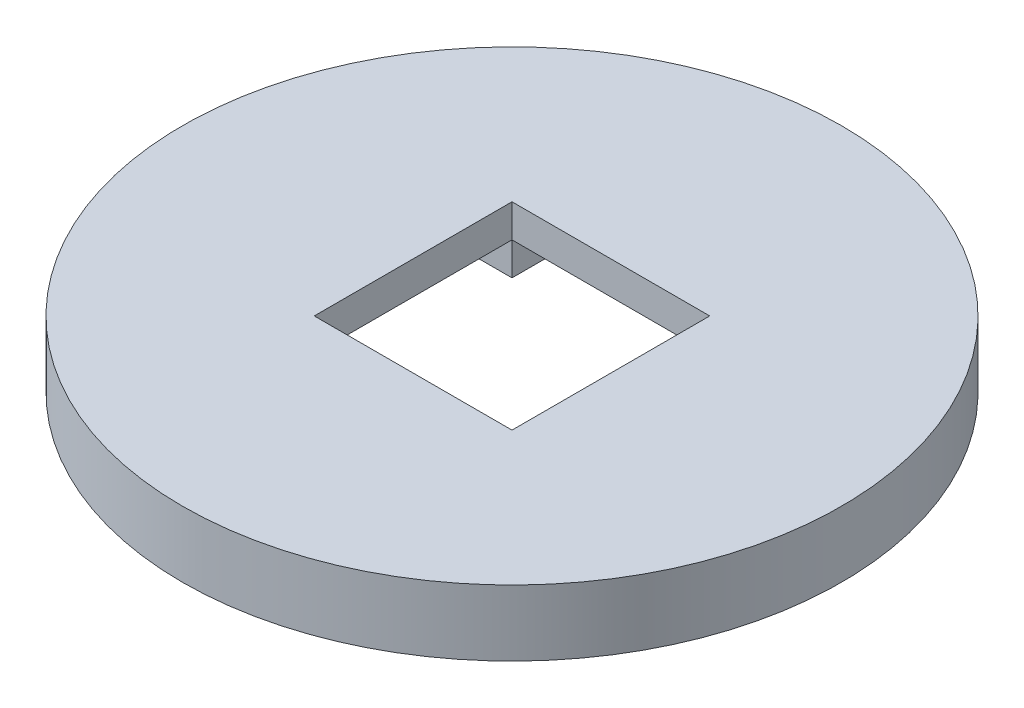
ISO-10303-21;
HEADER;
FILE_DESCRIPTION(('STEP AP214'),'2;1');
FILE_NAME('part.step','',(''),(''),'','','');
FILE_SCHEMA(('AUTOMOTIVE_DESIGN { 1 0 10303 214 1 1 1 1 }'));
ENDSEC;
DATA;
#1=APPLICATION_CONTEXT('core data for automotive mechanical design processes');
#2=APPLICATION_PROTOCOL_DEFINITION('international standard','automotive_design',2000,#1);
#3=PRODUCT_CONTEXT('',#1,'mechanical');
#4=PRODUCT('Part','Part','',(#3));
#5=PRODUCT_RELATED_PRODUCT_CATEGORY('part','',(#4));
#6=PRODUCT_DEFINITION_FORMATION('','',#4);
#7=PRODUCT_DEFINITION_CONTEXT('part definition',#1,'design');
#8=PRODUCT_DEFINITION('design','',#6,#7);
#9=PRODUCT_DEFINITION_SHAPE('','',#8);
#10=(LENGTH_UNIT() NAMED_UNIT(*) SI_UNIT(.MILLI.,.METRE.));
#11=(NAMED_UNIT(*) PLANE_ANGLE_UNIT() SI_UNIT($,.RADIAN.));
#12=(NAMED_UNIT(*) SI_UNIT($,.STERADIAN.) SOLID_ANGLE_UNIT());
#13=UNCERTAINTY_MEASURE_WITH_UNIT(LENGTH_MEASURE(1.E-05),#10,'distance_accuracy_value','');
#14=(GEOMETRIC_REPRESENTATION_CONTEXT(3) GLOBAL_UNCERTAINTY_ASSIGNED_CONTEXT((#13)) GLOBAL_UNIT_ASSIGNED_CONTEXT((#10,
#11,#12)) REPRESENTATION_CONTEXT('',''));
#15=CARTESIAN_POINT('',(0.,0.,0.));
#16=DIRECTION('',(0.,0.,1.));
#17=DIRECTION('',(1.,0.,0.));
#18=AXIS2_PLACEMENT_3D('',#15,#16,#17);
#19=CARTESIAN_POINT('',(0.,10.,15.));
#20=DIRECTION('',(0.,0.,-1.));
#21=DIRECTION('',(-1.,0.,0.));
#22=AXIS2_PLACEMENT_3D('',#19,#20,#21);
#23=PLANE('',#22);
#24=DIRECTION('',(1.,0.,0.));
#25=VECTOR('',#24,1.);
#26=CARTESIAN_POINT('',(0.,0.,15.));
#27=LINE('',#26,#25);
#28=CARTESIAN_POINT('',(15.,0.,15.));
#29=VERTEX_POINT('',#28);
#30=CARTESIAN_POINT('',(30.,0.,15.));
#31=VERTEX_POINT('',#30);
#32=EDGE_CURVE('E173',#29,#31,#27,.T.);
#33=ORIENTED_EDGE('',*,*,#32,.F.);
#34=DIRECTION('',(0.,-1.,0.));
#35=VECTOR('',#34,1.);
#36=CARTESIAN_POINT('',(15.,5.,15.));
#37=LINE('',#36,#35);
#38=CARTESIAN_POINT('',(15.,5.,15.));
#39=VERTEX_POINT('',#38);
#40=EDGE_CURVE('E148',#39,#29,#37,.T.);
#41=ORIENTED_EDGE('',*,*,#40,.F.);
#42=DIRECTION('',(1.,0.,0.));
#43=VECTOR('',#42,1.);
#44=CARTESIAN_POINT('',(0.,5.,15.));
#45=LINE('',#44,#43);
#46=CARTESIAN_POINT('',(30.,5.,15.));
#47=VERTEX_POINT('',#46);
#48=EDGE_CURVE('E171',#39,#47,#45,.T.);
#49=ORIENTED_EDGE('',*,*,#48,.T.);
#50=DIRECTION('',(0.,-1.,0.));
#51=VECTOR('',#50,1.);
#52=CARTESIAN_POINT('',(30.,5.,15.));
#53=LINE('',#52,#51);
#54=EDGE_CURVE('E241',#47,#31,#53,.T.);
#55=ORIENTED_EDGE('',*,*,#54,.T.);
#56=EDGE_LOOP('',(#33,#41,#49,#55));
#57=FACE_BOUND('',#56,.T.);
#58=ADVANCED_FACE('F39',(#57),#23,.T.);
#59=DIRECTION('',(0.,-1.,0.));
#60=VECTOR('',#59,1.);
#61=CARTESIAN_POINT('',(15.,10.,15.));
#62=LINE('',#61,#60);
#63=CARTESIAN_POINT('',(15.,10.,15.));
#64=VERTEX_POINT('',#63);
#65=EDGE_CURVE('E190',#64,#39,#62,.T.);
#66=ORIENTED_EDGE('',*,*,#65,.T.);
#67=DIRECTION('',(1.,0.,0.));
#68=VECTOR('',#67,1.);
#69=CARTESIAN_POINT('',(0.,5.,15.));
#70=LINE('',#69,#68);
#71=CARTESIAN_POINT('',(-15.,5.,15.));
#72=VERTEX_POINT('',#71);
#73=EDGE_CURVE('E155',#72,#39,#70,.T.);
#74=ORIENTED_EDGE('',*,*,#73,.F.);
#75=DIRECTION('',(0.,-1.,0.));
#76=VECTOR('',#75,1.);
#77=CARTESIAN_POINT('',(-15.,10.,15.));
#78=LINE('',#77,#76);
#79=CARTESIAN_POINT('',(-15.,10.,15.));
#80=VERTEX_POINT('',#79);
#81=EDGE_CURVE('E199',#80,#72,#78,.T.);
#82=ORIENTED_EDGE('',*,*,#81,.F.);
#83=DIRECTION('',(1.,0.,0.));
#84=VECTOR('',#83,1.);
#85=CARTESIAN_POINT('',(0.,10.,15.));
#86=LINE('',#85,#84);
#87=EDGE_CURVE('E197',#80,#64,#86,.T.);
#88=ORIENTED_EDGE('',*,*,#87,.T.);
#89=EDGE_LOOP('',(#66,#74,#82,#88));
#90=FACE_BOUND('',#89,.T.);
#91=ADVANCED_FACE('F195',(#90),#23,.T.);
#92=CARTESIAN_POINT('',(0.,0.,0.));
#93=DIRECTION('',(0.,1.,0.));
#94=DIRECTION('',(0.,0.,1.));
#95=AXIS2_PLACEMENT_3D('',#92,#93,#94);
#96=PLANE('',#95);
#97=CARTESIAN_POINT('',(0.,0.,0.));
#98=DIRECTION('',(0.,1.,0.));
#99=DIRECTION('',(0.,0.,1.));
#100=AXIS2_PLACEMENT_3D('',#97,#98,#99);
#101=CIRCLE('',#100,50.);
#102=CARTESIAN_POINT('',(0.,0.,50.));
#103=VERTEX_POINT('',#102);
#104=EDGE_CURVE('E43',#103,#103,#101,.T.);
#105=ORIENTED_EDGE('',*,*,#104,.F.);
#106=EDGE_LOOP('',(#105));
#107=FACE_BOUND('',#106,.T.);
#108=CARTESIAN_POINT('',(-30.,0.,15.));
#109=VERTEX_POINT('',#108);
#110=CARTESIAN_POINT('',(-15.,0.,15.));
#111=VERTEX_POINT('',#110);
#112=EDGE_CURVE('E223',#109,#111,#27,.T.);
#113=ORIENTED_EDGE('',*,*,#112,.T.);
#114=DIRECTION('',(0.,0.,-1.));
#115=VECTOR('',#114,1.);
#116=CARTESIAN_POINT('',(-15.,0.,0.));
#117=LINE('',#116,#115);
#118=CARTESIAN_POINT('',(-15.,0.,30.));
#119=VERTEX_POINT('',#118);
#120=EDGE_CURVE('E484',#119,#111,#117,.T.);
#121=ORIENTED_EDGE('',*,*,#120,.F.);
#122=DIRECTION('',(1.,0.,0.));
#123=VECTOR('',#122,1.);
#124=CARTESIAN_POINT('',(0.,0.,30.));
#125=LINE('',#124,#123);
#126=CARTESIAN_POINT('',(15.,0.,30.));
#127=VERTEX_POINT('',#126);
#128=EDGE_CURVE('E481',#119,#127,#125,.T.);
#129=ORIENTED_EDGE('',*,*,#128,.T.);
#130=DIRECTION('',(0.,0.,-1.));
#131=VECTOR('',#130,1.);
#132=CARTESIAN_POINT('',(15.,0.,0.));
#133=LINE('',#132,#131);
#134=EDGE_CURVE('E240',#127,#29,#133,.T.);
#135=ORIENTED_EDGE('',*,*,#134,.T.);
#136=ORIENTED_EDGE('',*,*,#32,.T.);
#137=DIRECTION('',(0.,0.,-1.));
#138=VECTOR('',#137,1.);
#139=CARTESIAN_POINT('',(30.,0.,0.));
#140=LINE('',#139,#138);
#141=CARTESIAN_POINT('',(30.,0.,-15.));
#142=VERTEX_POINT('',#141);
#143=EDGE_CURVE('E238',#31,#142,#140,.T.);
#144=ORIENTED_EDGE('',*,*,#143,.T.);
#145=DIRECTION('',(1.,0.,0.));
#146=VECTOR('',#145,1.);
#147=CARTESIAN_POINT('',(0.,0.,-15.));
#148=LINE('',#147,#146);
#149=CARTESIAN_POINT('',(15.,0.,-15.));
#150=VERTEX_POINT('',#149);
#151=EDGE_CURVE('E222',#150,#142,#148,.T.);
#152=ORIENTED_EDGE('',*,*,#151,.F.);
#153=DIRECTION('',(0.,0.,-1.));
#154=VECTOR('',#153,1.);
#155=CARTESIAN_POINT('',(15.,0.,0.));
#156=LINE('',#155,#154);
#157=CARTESIAN_POINT('',(15.,0.,-30.));
#158=VERTEX_POINT('',#157);
#159=EDGE_CURVE('E312',#150,#158,#156,.T.);
#160=ORIENTED_EDGE('',*,*,#159,.T.);
#161=DIRECTION('',(1.,0.,0.));
#162=VECTOR('',#161,1.);
#163=CARTESIAN_POINT('',(0.,0.,-30.));
#164=LINE('',#163,#162);
#165=CARTESIAN_POINT('',(-15.,0.,-30.));
#166=VERTEX_POINT('',#165);
#167=EDGE_CURVE('E328',#166,#158,#164,.T.);
#168=ORIENTED_EDGE('',*,*,#167,.F.);
#169=DIRECTION('',(0.,0.,-1.));
#170=VECTOR('',#169,1.);
#171=CARTESIAN_POINT('',(-15.,0.,0.));
#172=LINE('',#171,#170);
#173=CARTESIAN_POINT('',(-15.,0.,-15.));
#174=VERTEX_POINT('',#173);
#175=EDGE_CURVE('E324',#174,#166,#172,.T.);
#176=ORIENTED_EDGE('',*,*,#175,.F.);
#177=CARTESIAN_POINT('',(-30.,0.,-15.));
#178=VERTEX_POINT('',#177);
#179=EDGE_CURVE('E219',#178,#174,#148,.T.);
#180=ORIENTED_EDGE('',*,*,#179,.F.);
#181=DIRECTION('',(0.,0.,-1.));
#182=VECTOR('',#181,1.);
#183=CARTESIAN_POINT('',(-30.,0.,0.));
#184=LINE('',#183,#182);
#185=EDGE_CURVE('E259',#109,#178,#184,.T.);
#186=ORIENTED_EDGE('',*,*,#185,.F.);
#187=EDGE_LOOP('',(#113,#121,#129,#135,#136,#144,#152,#160,#168,#176,#180,#186));
#188=FACE_BOUND('',#187,.T.);
#189=ADVANCED_FACE('F235',(#107,#188),#96,.F.);
#190=CARTESIAN_POINT('',(0.,10.,-15.));
#191=DIRECTION('',(0.,0.,-1.));
#192=DIRECTION('',(-1.,0.,0.));
#193=AXIS2_PLACEMENT_3D('',#190,#191,#192);
#194=PLANE('',#193);
#195=DIRECTION('',(0.,-1.,0.));
#196=VECTOR('',#195,1.);
#197=CARTESIAN_POINT('',(15.,5.,-15.));
#198=LINE('',#197,#196);
#199=CARTESIAN_POINT('',(15.,5.,-15.));
#200=VERTEX_POINT('',#199);
#201=EDGE_CURVE('E55',#200,#150,#198,.T.);
#202=ORIENTED_EDGE('',*,*,#201,.T.);
#203=ORIENTED_EDGE('',*,*,#151,.T.);
#204=DIRECTION('',(0.,-1.,0.));
#205=VECTOR('',#204,1.);
#206=CARTESIAN_POINT('',(30.,5.,-15.));
#207=LINE('',#206,#205);
#208=CARTESIAN_POINT('',(30.,5.,-15.));
#209=VERTEX_POINT('',#208);
#210=EDGE_CURVE('E244',#209,#142,#207,.T.);
#211=ORIENTED_EDGE('',*,*,#210,.F.);
#212=DIRECTION('',(1.,0.,0.));
#213=VECTOR('',#212,1.);
#214=CARTESIAN_POINT('',(0.,5.,-15.));
#215=LINE('',#214,#213);
#216=EDGE_CURVE('E193',#200,#209,#215,.T.);
#217=ORIENTED_EDGE('',*,*,#216,.F.);
#218=EDGE_LOOP('',(#202,#203,#211,#217));
#219=FACE_BOUND('',#218,.T.);
#220=ADVANCED_FACE('F271',(#219),#194,.F.);
#221=DIRECTION('',(1.,0.,0.));
#222=VECTOR('',#221,1.);
#223=CARTESIAN_POINT('',(0.,5.,-15.));
#224=LINE('',#223,#222);
#225=CARTESIAN_POINT('',(-15.,5.,-15.));
#226=VERTEX_POINT('',#225);
#227=EDGE_CURVE('E267',#226,#200,#224,.T.);
#228=ORIENTED_EDGE('',*,*,#227,.T.);
#229=DIRECTION('',(0.,-1.,0.));
#230=VECTOR('',#229,1.);
#231=CARTESIAN_POINT('',(15.,10.,-15.));
#232=LINE('',#231,#230);
#233=CARTESIAN_POINT('',(15.,10.,-15.));
#234=VERTEX_POINT('',#233);
#235=EDGE_CURVE('E63',#234,#200,#232,.T.);
#236=ORIENTED_EDGE('',*,*,#235,.F.);
#237=DIRECTION('',(1.,0.,0.));
#238=VECTOR('',#237,1.);
#239=CARTESIAN_POINT('',(0.,10.,-15.));
#240=LINE('',#239,#238);
#241=CARTESIAN_POINT('',(-15.,10.,-15.));
#242=VERTEX_POINT('',#241);
#243=EDGE_CURVE('E215',#242,#234,#240,.T.);
#244=ORIENTED_EDGE('',*,*,#243,.F.);
#245=DIRECTION('',(0.,-1.,0.));
#246=VECTOR('',#245,1.);
#247=CARTESIAN_POINT('',(-15.,10.,-15.));
#248=LINE('',#247,#246);
#249=EDGE_CURVE('E205',#242,#226,#248,.T.);
#250=ORIENTED_EDGE('',*,*,#249,.T.);
#251=EDGE_LOOP('',(#228,#236,#244,#250));
#252=FACE_BOUND('',#251,.T.);
#253=ADVANCED_FACE('F266',(#252),#194,.F.);
#254=CARTESIAN_POINT('',(-15.,10.,0.));
#255=DIRECTION('',(-1.,0.,0.));
#256=DIRECTION('',(0.,0.,1.));
#257=AXIS2_PLACEMENT_3D('',#254,#255,#256);
#258=PLANE('',#257);
#259=DIRECTION('',(0.,0.,-1.));
#260=VECTOR('',#259,1.);
#261=CARTESIAN_POINT('',(-15.,5.,0.));
#262=LINE('',#261,#260);
#263=EDGE_CURVE('E351',#72,#226,#262,.T.);
#264=ORIENTED_EDGE('',*,*,#263,.T.);
#265=ORIENTED_EDGE('',*,*,#249,.F.);
#266=DIRECTION('',(0.,0.,-1.));
#267=VECTOR('',#266,1.);
#268=CARTESIAN_POINT('',(-15.,10.,0.));
#269=LINE('',#268,#267);
#270=EDGE_CURVE('E226',#80,#242,#269,.T.);
#271=ORIENTED_EDGE('',*,*,#270,.F.);
#272=ORIENTED_EDGE('',*,*,#81,.T.);
#273=EDGE_LOOP('',(#264,#265,#271,#272));
#274=FACE_BOUND('',#273,.T.);
#275=ADVANCED_FACE('F270',(#274),#258,.F.);
#276=CARTESIAN_POINT('',(15.,10.,0.));
#277=DIRECTION('',(-1.,0.,0.));
#278=DIRECTION('',(0.,0.,1.));
#279=AXIS2_PLACEMENT_3D('',#276,#277,#278);
#280=PLANE('',#279);
#281=ORIENTED_EDGE('',*,*,#235,.T.);
#282=DIRECTION('',(0.,0.,-1.));
#283=VECTOR('',#282,1.);
#284=CARTESIAN_POINT('',(15.,5.,0.));
#285=LINE('',#284,#283);
#286=EDGE_CURVE('E183',#39,#200,#285,.T.);
#287=ORIENTED_EDGE('',*,*,#286,.F.);
#288=ORIENTED_EDGE('',*,*,#65,.F.);
#289=DIRECTION('',(0.,0.,-1.));
#290=VECTOR('',#289,1.);
#291=CARTESIAN_POINT('',(15.,10.,0.));
#292=LINE('',#291,#290);
#293=EDGE_CURVE('E212',#64,#234,#292,.T.);
#294=ORIENTED_EDGE('',*,*,#293,.T.);
#295=EDGE_LOOP('',(#281,#287,#288,#294));
#296=FACE_BOUND('',#295,.T.);
#297=ADVANCED_FACE('F189',(#296),#280,.T.);
#298=CARTESIAN_POINT('',(0.,10.,0.));
#299=DIRECTION('',(0.,-1.,0.));
#300=DIRECTION('',(0.,0.,-1.));
#301=AXIS2_PLACEMENT_3D('',#298,#299,#300);
#302=CYLINDRICAL_SURFACE('',#301,50.);
#303=CARTESIAN_POINT('',(0.,10.,0.));
#304=DIRECTION('',(0.,1.,0.));
#305=DIRECTION('',(0.,0.,1.));
#306=AXIS2_PLACEMENT_3D('',#303,#304,#305);
#307=CIRCLE('',#306,50.);
#308=CARTESIAN_POINT('',(0.,10.,50.));
#309=VERTEX_POINT('',#308);
#310=EDGE_CURVE('E11',#309,#309,#307,.T.);
#311=ORIENTED_EDGE('',*,*,#310,.F.);
#312=EDGE_LOOP('',(#311));
#313=FACE_BOUND('',#312,.T.);
#314=ORIENTED_EDGE('',*,*,#104,.T.);
#315=EDGE_LOOP('',(#314));
#316=FACE_BOUND('',#315,.T.);
#317=ADVANCED_FACE('F41',(#313,#316),#302,.T.);
#318=CARTESIAN_POINT('',(0.,10.,0.));
#319=DIRECTION('',(0.,1.,0.));
#320=DIRECTION('',(0.,0.,1.));
#321=AXIS2_PLACEMENT_3D('',#318,#319,#320);
#322=PLANE('',#321);
#323=ORIENTED_EDGE('',*,*,#270,.T.);
#324=ORIENTED_EDGE('',*,*,#243,.T.);
#325=ORIENTED_EDGE('',*,*,#293,.F.);
#326=ORIENTED_EDGE('',*,*,#87,.F.);
#327=EDGE_LOOP('',(#323,#324,#325,#326));
#328=FACE_BOUND('',#327,.T.);
#329=ORIENTED_EDGE('',*,*,#310,.T.);
#330=EDGE_LOOP('',(#329));
#331=FACE_BOUND('',#330,.T.);
#332=ADVANCED_FACE('F263',(#328,#331),#322,.T.);
#333=DIRECTION('',(0.,-1.,0.));
#334=VECTOR('',#333,1.);
#335=CARTESIAN_POINT('',(-15.,5.,15.));
#336=LINE('',#335,#334);
#337=EDGE_CURVE('E175',#72,#111,#336,.T.);
#338=ORIENTED_EDGE('',*,*,#337,.T.);
#339=ORIENTED_EDGE('',*,*,#112,.F.);
#340=DIRECTION('',(0.,-1.,0.));
#341=VECTOR('',#340,1.);
#342=CARTESIAN_POINT('',(-30.,5.,15.));
#343=LINE('',#342,#341);
#344=CARTESIAN_POINT('',(-30.,5.,15.));
#345=VERTEX_POINT('',#344);
#346=EDGE_CURVE('E361',#345,#109,#343,.T.);
#347=ORIENTED_EDGE('',*,*,#346,.F.);
#348=DIRECTION('',(1.,0.,0.));
#349=VECTOR('',#348,1.);
#350=CARTESIAN_POINT('',(0.,5.,15.));
#351=LINE('',#350,#349);
#352=EDGE_CURVE('E300',#345,#72,#351,.T.);
#353=ORIENTED_EDGE('',*,*,#352,.T.);
#354=EDGE_LOOP('',(#338,#339,#347,#353));
#355=FACE_BOUND('',#354,.T.);
#356=ADVANCED_FACE('F283',(#355),#23,.T.);
#357=ORIENTED_EDGE('',*,*,#179,.T.);
#358=DIRECTION('',(0.,-1.,0.));
#359=VECTOR('',#358,1.);
#360=CARTESIAN_POINT('',(-15.,5.,-15.));
#361=LINE('',#360,#359);
#362=EDGE_CURVE('E323',#226,#174,#361,.T.);
#363=ORIENTED_EDGE('',*,*,#362,.F.);
#364=DIRECTION('',(1.,0.,0.));
#365=VECTOR('',#364,1.);
#366=CARTESIAN_POINT('',(0.,5.,-15.));
#367=LINE('',#366,#365);
#368=CARTESIAN_POINT('',(-30.,5.,-15.));
#369=VERTEX_POINT('',#368);
#370=EDGE_CURVE('E347',#369,#226,#367,.T.);
#371=ORIENTED_EDGE('',*,*,#370,.F.);
#372=DIRECTION('',(0.,-1.,0.));
#373=VECTOR('',#372,1.);
#374=CARTESIAN_POINT('',(-30.,5.,-15.));
#375=LINE('',#374,#373);
#376=EDGE_CURVE('E357',#369,#178,#375,.T.);
#377=ORIENTED_EDGE('',*,*,#376,.T.);
#378=EDGE_LOOP('',(#357,#363,#371,#377));
#379=FACE_BOUND('',#378,.T.);
#380=ADVANCED_FACE('F273',(#379),#194,.F.);
#381=CARTESIAN_POINT('',(30.,5.,0.));
#382=DIRECTION('',(-1.,0.,0.));
#383=DIRECTION('',(0.,0.,1.));
#384=AXIS2_PLACEMENT_3D('',#381,#382,#383);
#385=PLANE('',#384);
#386=ORIENTED_EDGE('',*,*,#143,.F.);
#387=ORIENTED_EDGE('',*,*,#54,.F.);
#388=DIRECTION('',(0.,0.,-1.));
#389=VECTOR('',#388,1.);
#390=CARTESIAN_POINT('',(30.,5.,0.));
#391=LINE('',#390,#389);
#392=EDGE_CURVE('E184',#47,#209,#391,.T.);
#393=ORIENTED_EDGE('',*,*,#392,.T.);
#394=ORIENTED_EDGE('',*,*,#210,.T.);
#395=EDGE_LOOP('',(#386,#387,#393,#394));
#396=FACE_BOUND('',#395,.T.);
#397=ADVANCED_FACE('F247',(#396),#385,.T.);
#398=CARTESIAN_POINT('',(0.,5.,0.));
#399=DIRECTION('',(0.,-1.,0.));
#400=DIRECTION('',(0.,0.,-1.));
#401=AXIS2_PLACEMENT_3D('',#398,#399,#400);
#402=PLANE('',#401);
#403=ORIENTED_EDGE('',*,*,#392,.F.);
#404=ORIENTED_EDGE('',*,*,#48,.F.);
#405=ORIENTED_EDGE('',*,*,#286,.T.);
#406=ORIENTED_EDGE('',*,*,#216,.T.);
#407=EDGE_LOOP('',(#403,#404,#405,#406));
#408=FACE_BOUND('',#407,.T.);
#409=ADVANCED_FACE('F181',(#408),#402,.T.);
#410=CARTESIAN_POINT('',(-30.,5.,0.));
#411=DIRECTION('',(-1.,0.,0.));
#412=DIRECTION('',(0.,0.,1.));
#413=AXIS2_PLACEMENT_3D('',#410,#411,#412);
#414=PLANE('',#413);
#415=ORIENTED_EDGE('',*,*,#185,.T.);
#416=ORIENTED_EDGE('',*,*,#376,.F.);
#417=DIRECTION('',(0.,0.,-1.));
#418=VECTOR('',#417,1.);
#419=CARTESIAN_POINT('',(-30.,5.,0.));
#420=LINE('',#419,#418);
#421=EDGE_CURVE('E343',#345,#369,#420,.T.);
#422=ORIENTED_EDGE('',*,*,#421,.F.);
#423=ORIENTED_EDGE('',*,*,#346,.T.);
#424=EDGE_LOOP('',(#415,#416,#422,#423));
#425=FACE_BOUND('',#424,.T.);
#426=ADVANCED_FACE('F370',(#425),#414,.F.);
#427=CARTESIAN_POINT('',(0.,5.,0.));
#428=DIRECTION('',(0.,-1.,0.));
#429=DIRECTION('',(0.,0.,-1.));
#430=AXIS2_PLACEMENT_3D('',#427,#428,#429);
#431=PLANE('',#430);
#432=ORIENTED_EDGE('',*,*,#421,.T.);
#433=ORIENTED_EDGE('',*,*,#370,.T.);
#434=ORIENTED_EDGE('',*,*,#263,.F.);
#435=ORIENTED_EDGE('',*,*,#352,.F.);
#436=EDGE_LOOP('',(#432,#433,#434,#435));
#437=FACE_BOUND('',#436,.T.);
#438=ADVANCED_FACE('F378',(#437),#431,.T.);
#439=CARTESIAN_POINT('',(15.,5.,0.));
#440=DIRECTION('',(-1.,0.,0.));
#441=DIRECTION('',(0.,0.,1.));
#442=AXIS2_PLACEMENT_3D('',#439,#440,#441);
#443=PLANE('',#442);
#444=ORIENTED_EDGE('',*,*,#159,.F.);
#445=ORIENTED_EDGE('',*,*,#201,.F.);
#446=DIRECTION('',(0.,0.,-1.));
#447=VECTOR('',#446,1.);
#448=CARTESIAN_POINT('',(15.,5.,0.));
#449=LINE('',#448,#447);
#450=CARTESIAN_POINT('',(15.,5.,-30.));
#451=VERTEX_POINT('',#450);
#452=EDGE_CURVE('E320',#200,#451,#449,.T.);
#453=ORIENTED_EDGE('',*,*,#452,.T.);
#454=DIRECTION('',(0.,-1.,0.));
#455=VECTOR('',#454,1.);
#456=CARTESIAN_POINT('',(15.,5.,-30.));
#457=LINE('',#456,#455);
#458=EDGE_CURVE('E254',#451,#158,#457,.T.);
#459=ORIENTED_EDGE('',*,*,#458,.T.);
#460=EDGE_LOOP('',(#444,#445,#453,#459));
#461=FACE_BOUND('',#460,.T.);
#462=ADVANCED_FACE('F380',(#461),#443,.T.);
#463=CARTESIAN_POINT('',(0.,5.,-30.));
#464=DIRECTION('',(0.,0.,-1.));
#465=DIRECTION('',(-1.,0.,0.));
#466=AXIS2_PLACEMENT_3D('',#463,#464,#465);
#467=PLANE('',#466);
#468=ORIENTED_EDGE('',*,*,#167,.T.);
#469=ORIENTED_EDGE('',*,*,#458,.F.);
#470=DIRECTION('',(1.,0.,0.));
#471=VECTOR('',#470,1.);
#472=CARTESIAN_POINT('',(0.,5.,-30.));
#473=LINE('',#472,#471);
#474=CARTESIAN_POINT('',(-15.,5.,-30.));
#475=VERTEX_POINT('',#474);
#476=EDGE_CURVE('E316',#475,#451,#473,.T.);
#477=ORIENTED_EDGE('',*,*,#476,.F.);
#478=DIRECTION('',(0.,-1.,0.));
#479=VECTOR('',#478,1.);
#480=CARTESIAN_POINT('',(-15.,5.,-30.));
#481=LINE('',#480,#479);
#482=EDGE_CURVE('E338',#475,#166,#481,.T.);
#483=ORIENTED_EDGE('',*,*,#482,.T.);
#484=EDGE_LOOP('',(#468,#469,#477,#483));
#485=FACE_BOUND('',#484,.T.);
#486=ADVANCED_FACE('F386',(#485),#467,.F.);
#487=CARTESIAN_POINT('',(-15.,5.,0.));
#488=DIRECTION('',(-1.,0.,0.));
#489=DIRECTION('',(0.,0.,1.));
#490=AXIS2_PLACEMENT_3D('',#487,#488,#489);
#491=PLANE('',#490);
#492=ORIENTED_EDGE('',*,*,#175,.T.);
#493=ORIENTED_EDGE('',*,*,#482,.F.);
#494=DIRECTION('',(0.,0.,-1.));
#495=VECTOR('',#494,1.);
#496=CARTESIAN_POINT('',(-15.,5.,0.));
#497=LINE('',#496,#495);
#498=EDGE_CURVE('E311',#226,#475,#497,.T.);
#499=ORIENTED_EDGE('',*,*,#498,.F.);
#500=ORIENTED_EDGE('',*,*,#362,.T.);
#501=EDGE_LOOP('',(#492,#493,#499,#500));
#502=FACE_BOUND('',#501,.T.);
#503=ADVANCED_FACE('F374',(#502),#491,.F.);
#504=CARTESIAN_POINT('',(0.,5.,0.));
#505=DIRECTION('',(0.,-1.,0.));
#506=DIRECTION('',(0.,0.,-1.));
#507=AXIS2_PLACEMENT_3D('',#504,#505,#506);
#508=PLANE('',#507);
#509=ORIENTED_EDGE('',*,*,#227,.F.);
#510=ORIENTED_EDGE('',*,*,#498,.T.);
#511=ORIENTED_EDGE('',*,*,#476,.T.);
#512=ORIENTED_EDGE('',*,*,#452,.F.);
#513=EDGE_LOOP('',(#509,#510,#511,#512));
#514=FACE_BOUND('',#513,.T.);
#515=ADVANCED_FACE('F433',(#514),#508,.T.);
#516=CARTESIAN_POINT('',(-15.,5.,0.));
#517=DIRECTION('',(-1.,0.,0.));
#518=DIRECTION('',(0.,0.,1.));
#519=AXIS2_PLACEMENT_3D('',#516,#517,#518);
#520=PLANE('',#519);
#521=ORIENTED_EDGE('',*,*,#120,.T.);
#522=ORIENTED_EDGE('',*,*,#337,.F.);
#523=DIRECTION('',(0.,0.,-1.));
#524=VECTOR('',#523,1.);
#525=CARTESIAN_POINT('',(-15.,5.,0.));
#526=LINE('',#525,#524);
#527=CARTESIAN_POINT('',(-15.,5.,30.));
#528=VERTEX_POINT('',#527);
#529=EDGE_CURVE('E160',#528,#72,#526,.T.);
#530=ORIENTED_EDGE('',*,*,#529,.F.);
#531=DIRECTION('',(0.,-1.,0.));
#532=VECTOR('',#531,1.);
#533=CARTESIAN_POINT('',(-15.,5.,30.));
#534=LINE('',#533,#532);
#535=EDGE_CURVE('E329',#528,#119,#534,.T.);
#536=ORIENTED_EDGE('',*,*,#535,.T.);
#537=EDGE_LOOP('',(#521,#522,#530,#536));
#538=FACE_BOUND('',#537,.T.);
#539=ADVANCED_FACE('F441',(#538),#520,.F.);
#540=CARTESIAN_POINT('',(0.,5.,30.));
#541=DIRECTION('',(0.,0.,-1.));
#542=DIRECTION('',(-1.,0.,0.));
#543=AXIS2_PLACEMENT_3D('',#540,#541,#542);
#544=PLANE('',#543);
#545=ORIENTED_EDGE('',*,*,#128,.F.);
#546=ORIENTED_EDGE('',*,*,#535,.F.);
#547=DIRECTION('',(1.,0.,0.));
#548=VECTOR('',#547,1.);
#549=CARTESIAN_POINT('',(0.,5.,30.));
#550=LINE('',#549,#548);
#551=CARTESIAN_POINT('',(15.,5.,30.));
#552=VERTEX_POINT('',#551);
#553=EDGE_CURVE('E154',#528,#552,#550,.T.);
#554=ORIENTED_EDGE('',*,*,#553,.T.);
#555=DIRECTION('',(0.,-1.,0.));
#556=VECTOR('',#555,1.);
#557=CARTESIAN_POINT('',(15.,5.,30.));
#558=LINE('',#557,#556);
#559=EDGE_CURVE('E150',#552,#127,#558,.T.);
#560=ORIENTED_EDGE('',*,*,#559,.T.);
#561=EDGE_LOOP('',(#545,#546,#554,#560));
#562=FACE_BOUND('',#561,.T.);
#563=ADVANCED_FACE('F451',(#562),#544,.T.);
#564=CARTESIAN_POINT('',(15.,5.,0.));
#565=DIRECTION('',(-1.,0.,0.));
#566=DIRECTION('',(0.,0.,1.));
#567=AXIS2_PLACEMENT_3D('',#564,#565,#566);
#568=PLANE('',#567);
#569=ORIENTED_EDGE('',*,*,#134,.F.);
#570=ORIENTED_EDGE('',*,*,#559,.F.);
#571=DIRECTION('',(0.,0.,-1.));
#572=VECTOR('',#571,1.);
#573=CARTESIAN_POINT('',(15.,5.,0.));
#574=LINE('',#573,#572);
#575=EDGE_CURVE('E143',#552,#39,#574,.T.);
#576=ORIENTED_EDGE('',*,*,#575,.T.);
#577=ORIENTED_EDGE('',*,*,#40,.T.);
#578=EDGE_LOOP('',(#569,#570,#576,#577));
#579=FACE_BOUND('',#578,.T.);
#580=ADVANCED_FACE('F146',(#579),#568,.T.);
#581=CARTESIAN_POINT('',(0.,5.,0.));
#582=DIRECTION('',(0.,-1.,0.));
#583=DIRECTION('',(0.,0.,-1.));
#584=AXIS2_PLACEMENT_3D('',#581,#582,#583);
#585=PLANE('',#584);
#586=ORIENTED_EDGE('',*,*,#529,.T.);
#587=ORIENTED_EDGE('',*,*,#73,.T.);
#588=ORIENTED_EDGE('',*,*,#575,.F.);
#589=ORIENTED_EDGE('',*,*,#553,.F.);
#590=EDGE_LOOP('',(#586,#587,#588,#589));
#591=FACE_BOUND('',#590,.T.);
#592=ADVANCED_FACE('F158',(#591),#585,.T.);
#593=CLOSED_SHELL('',(#58,#91,#189,#220,#253,#275,#297,#317,#332,#356,#380,#397,#409,#426,#438,
#462,#486,#503,#515,#539,#563,#580,#592));
#594=MANIFOLD_SOLID_BREP('B2',#593);
#595=ADVANCED_BREP_SHAPE_REPRESENTATION('',(#18,#594),#14);
#596=SHAPE_DEFINITION_REPRESENTATION(#9,#595);
ENDSEC;
END-ISO-10303-21;
